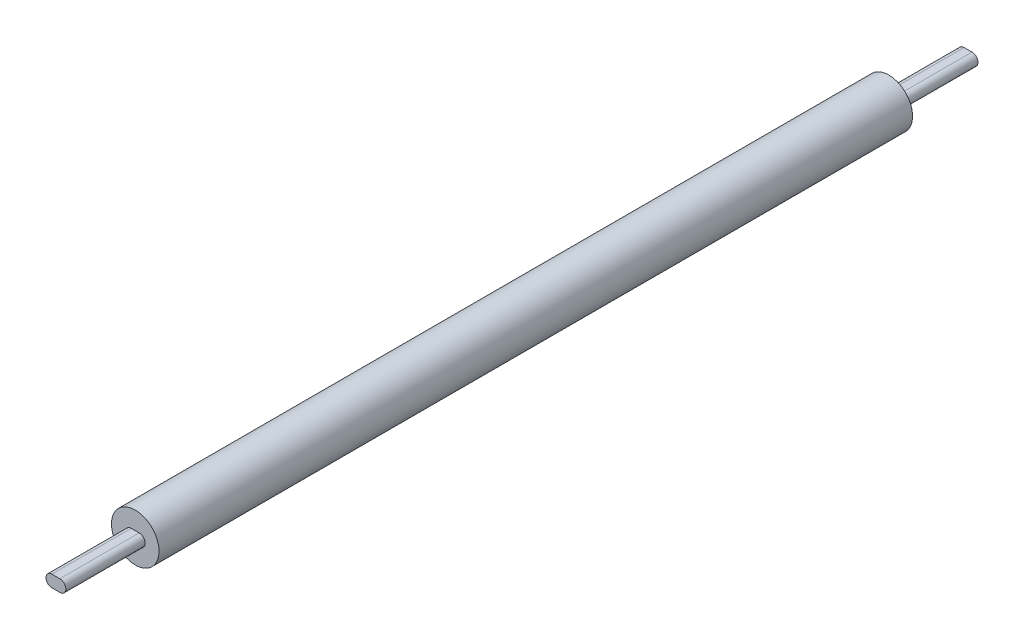
ISO-10303-21;
HEADER;
FILE_DESCRIPTION(('STEP AP214'),'2;1');
FILE_NAME('part.step','',(''),(''),'','','');
FILE_SCHEMA(('AUTOMOTIVE_DESIGN { 1 0 10303 214 1 1 1 1 }'));
ENDSEC;
DATA;
#1=APPLICATION_CONTEXT('core data for automotive mechanical design processes');
#2=APPLICATION_PROTOCOL_DEFINITION('international standard','automotive_design',2000,#1);
#3=PRODUCT_CONTEXT('',#1,'mechanical');
#4=PRODUCT('Part','Part','',(#3));
#5=PRODUCT_RELATED_PRODUCT_CATEGORY('part','',(#4));
#6=PRODUCT_DEFINITION_FORMATION('','',#4);
#7=PRODUCT_DEFINITION_CONTEXT('part definition',#1,'design');
#8=PRODUCT_DEFINITION('design','',#6,#7);
#9=PRODUCT_DEFINITION_SHAPE('','',#8);
#10=(LENGTH_UNIT() NAMED_UNIT(*) SI_UNIT(.MILLI.,.METRE.));
#11=(NAMED_UNIT(*) PLANE_ANGLE_UNIT() SI_UNIT($,.RADIAN.));
#12=(NAMED_UNIT(*) SI_UNIT($,.STERADIAN.) SOLID_ANGLE_UNIT());
#13=UNCERTAINTY_MEASURE_WITH_UNIT(LENGTH_MEASURE(1.E-05),#10,'distance_accuracy_value','');
#14=(GEOMETRIC_REPRESENTATION_CONTEXT(3) GLOBAL_UNCERTAINTY_ASSIGNED_CONTEXT((#13)) GLOBAL_UNIT_ASSIGNED_CONTEXT((#10,
#11,#12)) REPRESENTATION_CONTEXT('',''));
#15=CARTESIAN_POINT('',(0.,0.,0.));
#16=DIRECTION('',(0.,0.,1.));
#17=DIRECTION('',(1.,0.,0.));
#18=AXIS2_PLACEMENT_3D('',#15,#16,#17);
#19=CARTESIAN_POINT('',(0.,0.,0.));
#20=DIRECTION('',(0.,0.,1.));
#21=DIRECTION('',(1.,0.,0.));
#22=AXIS2_PLACEMENT_3D('',#19,#20,#21);
#23=PLANE('',#22);
#24=CARTESIAN_POINT('',(0.,0.,0.));
#25=DIRECTION('',(0.,0.,1.));
#26=DIRECTION('',(1.,0.,0.));
#27=AXIS2_PLACEMENT_3D('',#24,#25,#26);
#28=CIRCLE('',#27,6.);
#29=CARTESIAN_POINT('',(6.,0.,0.));
#30=VERTEX_POINT('',#29);
#31=EDGE_CURVE('E45',#30,#30,#28,.T.);
#32=ORIENTED_EDGE('',*,*,#31,.F.);
#33=EDGE_LOOP('',(#32));
#34=FACE_BOUND('',#33,.T.);
#35=CARTESIAN_POINT('',(1.,0.,0.));
#36=DIRECTION('',(0.,0.,-1.));
#37=DIRECTION('',(-1.,0.,0.));
#38=AXIS2_PLACEMENT_3D('',#35,#36,#37);
#39=CIRCLE('',#38,1.5);
#40=CARTESIAN_POINT('',(1.,1.5,0.));
#41=VERTEX_POINT('',#40);
#42=CARTESIAN_POINT('',(1.,-1.5,0.));
#43=VERTEX_POINT('',#42);
#44=EDGE_CURVE('E56',#41,#43,#39,.T.);
#45=ORIENTED_EDGE('',*,*,#44,.F.);
#46=DIRECTION('',(1.,0.,0.));
#47=VECTOR('',#46,1.);
#48=CARTESIAN_POINT('',(1.,1.5,0.));
#49=LINE('',#48,#47);
#50=CARTESIAN_POINT('',(-1.,1.5,0.));
#51=VERTEX_POINT('',#50);
#52=EDGE_CURVE('E60',#51,#41,#49,.T.);
#53=ORIENTED_EDGE('',*,*,#52,.F.);
#54=CARTESIAN_POINT('',(-1.,0.,0.));
#55=DIRECTION('',(0.,0.,-1.));
#56=DIRECTION('',(-1.,0.,0.));
#57=AXIS2_PLACEMENT_3D('',#54,#55,#56);
#58=CIRCLE('',#57,1.5);
#59=CARTESIAN_POINT('',(-1.,-1.5,0.));
#60=VERTEX_POINT('',#59);
#61=EDGE_CURVE('E290',#60,#51,#58,.T.);
#62=ORIENTED_EDGE('',*,*,#61,.F.);
#63=DIRECTION('',(-1.,0.,0.));
#64=VECTOR('',#63,1.);
#65=CARTESIAN_POINT('',(1.,-1.5,0.));
#66=LINE('',#65,#64);
#67=EDGE_CURVE('E296',#43,#60,#66,.T.);
#68=ORIENTED_EDGE('',*,*,#67,.F.);
#69=EDGE_LOOP('',(#45,#53,#62,#68));
#70=FACE_BOUND('',#69,.T.);
#71=ADVANCED_FACE('F41',(#34,#70),#23,.F.);
#72=CARTESIAN_POINT('',(0.,0.,190.));
#73=DIRECTION('',(0.,0.,-1.));
#74=DIRECTION('',(-1.,0.,0.));
#75=AXIS2_PLACEMENT_3D('',#72,#73,#74);
#76=CYLINDRICAL_SURFACE('',#75,6.);
#77=CARTESIAN_POINT('',(0.,0.,190.));
#78=DIRECTION('',(0.,0.,1.));
#79=DIRECTION('',(1.,0.,0.));
#80=AXIS2_PLACEMENT_3D('',#77,#78,#79);
#81=CIRCLE('',#80,6.);
#82=CARTESIAN_POINT('',(6.,0.,190.));
#83=VERTEX_POINT('',#82);
#84=EDGE_CURVE('E11',#83,#83,#81,.T.);
#85=ORIENTED_EDGE('',*,*,#84,.F.);
#86=EDGE_LOOP('',(#85));
#87=FACE_BOUND('',#86,.T.);
#88=ORIENTED_EDGE('',*,*,#31,.T.);
#89=EDGE_LOOP('',(#88));
#90=FACE_BOUND('',#89,.T.);
#91=ADVANCED_FACE('F43',(#87,#90),#76,.T.);
#92=CARTESIAN_POINT('',(0.,0.,190.));
#93=DIRECTION('',(0.,0.,1.));
#94=DIRECTION('',(1.,0.,0.));
#95=AXIS2_PLACEMENT_3D('',#92,#93,#94);
#96=PLANE('',#95);
#97=CARTESIAN_POINT('',(-1.,0.,190.));
#98=DIRECTION('',(0.,0.,1.));
#99=DIRECTION('',(1.,0.,0.));
#100=AXIS2_PLACEMENT_3D('',#97,#98,#99);
#101=CIRCLE('',#100,1.5);
#102=CARTESIAN_POINT('',(-1.,1.5,190.));
#103=VERTEX_POINT('',#102);
#104=CARTESIAN_POINT('',(-1.,-1.5,190.));
#105=VERTEX_POINT('',#104);
#106=EDGE_CURVE('E126',#103,#105,#101,.T.);
#107=ORIENTED_EDGE('',*,*,#106,.F.);
#108=DIRECTION('',(-1.,0.,0.));
#109=VECTOR('',#108,1.);
#110=CARTESIAN_POINT('',(-1.,1.5,190.));
#111=LINE('',#110,#109);
#112=CARTESIAN_POINT('',(1.,1.5,190.));
#113=VERTEX_POINT('',#112);
#114=EDGE_CURVE('E139',#113,#103,#111,.T.);
#115=ORIENTED_EDGE('',*,*,#114,.F.);
#116=CARTESIAN_POINT('',(1.,0.,190.));
#117=DIRECTION('',(0.,0.,1.));
#118=DIRECTION('',(1.,0.,0.));
#119=AXIS2_PLACEMENT_3D('',#116,#117,#118);
#120=CIRCLE('',#119,1.5);
#121=CARTESIAN_POINT('',(1.,-1.5,190.));
#122=VERTEX_POINT('',#121);
#123=EDGE_CURVE('E148',#122,#113,#120,.T.);
#124=ORIENTED_EDGE('',*,*,#123,.F.);
#125=DIRECTION('',(1.,0.,0.));
#126=VECTOR('',#125,1.);
#127=CARTESIAN_POINT('',(-1.,-1.5,190.));
#128=LINE('',#127,#126);
#129=EDGE_CURVE('E129',#105,#122,#128,.T.);
#130=ORIENTED_EDGE('',*,*,#129,.F.);
#131=EDGE_LOOP('',(#107,#115,#124,#130));
#132=FACE_BOUND('',#131,.T.);
#133=ORIENTED_EDGE('',*,*,#84,.T.);
#134=EDGE_LOOP('',(#133));
#135=FACE_BOUND('',#134,.T.);
#136=ADVANCED_FACE('F173',(#132,#135),#96,.T.);
#137=CARTESIAN_POINT('',(-1.,0.,210.));
#138=DIRECTION('',(0.,0.,-1.));
#139=DIRECTION('',(-1.,0.,0.));
#140=AXIS2_PLACEMENT_3D('',#137,#138,#139);
#141=CYLINDRICAL_SURFACE('',#140,1.5);
#142=ORIENTED_EDGE('',*,*,#106,.T.);
#143=DIRECTION('',(0.,0.,-1.));
#144=VECTOR('',#143,1.);
#145=CARTESIAN_POINT('',(-1.,-1.5,210.));
#146=LINE('',#145,#144);
#147=CARTESIAN_POINT('',(-1.,-1.5,210.));
#148=VERTEX_POINT('',#147);
#149=EDGE_CURVE('E161',#148,#105,#146,.T.);
#150=ORIENTED_EDGE('',*,*,#149,.F.);
#151=CARTESIAN_POINT('',(-1.,0.,210.));
#152=DIRECTION('',(0.,0.,1.));
#153=DIRECTION('',(1.,0.,0.));
#154=AXIS2_PLACEMENT_3D('',#151,#152,#153);
#155=CIRCLE('',#154,1.5);
#156=CARTESIAN_POINT('',(-1.,1.5,210.));
#157=VERTEX_POINT('',#156);
#158=EDGE_CURVE('E135',#157,#148,#155,.T.);
#159=ORIENTED_EDGE('',*,*,#158,.F.);
#160=DIRECTION('',(0.,0.,-1.));
#161=VECTOR('',#160,1.);
#162=CARTESIAN_POINT('',(-1.,1.5,210.));
#163=LINE('',#162,#161);
#164=EDGE_CURVE('E144',#157,#103,#163,.T.);
#165=ORIENTED_EDGE('',*,*,#164,.T.);
#166=EDGE_LOOP('',(#142,#150,#159,#165));
#167=FACE_BOUND('',#166,.T.);
#168=ADVANCED_FACE('F178',(#167),#141,.T.);
#169=CARTESIAN_POINT('',(-1.,-1.5,210.));
#170=DIRECTION('',(0.,1.,0.));
#171=DIRECTION('',(0.,0.,1.));
#172=AXIS2_PLACEMENT_3D('',#169,#170,#171);
#173=PLANE('',#172);
#174=ORIENTED_EDGE('',*,*,#129,.T.);
#175=DIRECTION('',(0.,0.,-1.));
#176=VECTOR('',#175,1.);
#177=CARTESIAN_POINT('',(1.,-1.5,210.));
#178=LINE('',#177,#176);
#179=CARTESIAN_POINT('',(1.,-1.5,210.));
#180=VERTEX_POINT('',#179);
#181=EDGE_CURVE('E158',#180,#122,#178,.T.);
#182=ORIENTED_EDGE('',*,*,#181,.F.);
#183=DIRECTION('',(1.,0.,0.));
#184=VECTOR('',#183,1.);
#185=CARTESIAN_POINT('',(-1.,-1.5,210.));
#186=LINE('',#185,#184);
#187=EDGE_CURVE('E138',#148,#180,#186,.T.);
#188=ORIENTED_EDGE('',*,*,#187,.F.);
#189=ORIENTED_EDGE('',*,*,#149,.T.);
#190=EDGE_LOOP('',(#174,#182,#188,#189));
#191=FACE_BOUND('',#190,.T.);
#192=ADVANCED_FACE('F182',(#191),#173,.F.);
#193=CARTESIAN_POINT('',(1.,0.,210.));
#194=DIRECTION('',(0.,0.,-1.));
#195=DIRECTION('',(-1.,0.,0.));
#196=AXIS2_PLACEMENT_3D('',#193,#194,#195);
#197=CYLINDRICAL_SURFACE('',#196,1.5);
#198=ORIENTED_EDGE('',*,*,#123,.T.);
#199=DIRECTION('',(0.,0.,-1.));
#200=VECTOR('',#199,1.);
#201=CARTESIAN_POINT('',(1.,1.5,210.));
#202=LINE('',#201,#200);
#203=CARTESIAN_POINT('',(1.,1.5,210.));
#204=VERTEX_POINT('',#203);
#205=EDGE_CURVE('E155',#204,#113,#202,.T.);
#206=ORIENTED_EDGE('',*,*,#205,.F.);
#207=CARTESIAN_POINT('',(1.,0.,210.));
#208=DIRECTION('',(0.,0.,1.));
#209=DIRECTION('',(1.,0.,0.));
#210=AXIS2_PLACEMENT_3D('',#207,#208,#209);
#211=CIRCLE('',#210,1.5);
#212=EDGE_CURVE('E141',#180,#204,#211,.T.);
#213=ORIENTED_EDGE('',*,*,#212,.F.);
#214=ORIENTED_EDGE('',*,*,#181,.T.);
#215=EDGE_LOOP('',(#198,#206,#213,#214));
#216=FACE_BOUND('',#215,.T.);
#217=ADVANCED_FACE('F186',(#216),#197,.T.);
#218=CARTESIAN_POINT('',(-1.,1.5,210.));
#219=DIRECTION('',(0.,-1.,0.));
#220=DIRECTION('',(0.,0.,-1.));
#221=AXIS2_PLACEMENT_3D('',#218,#219,#220);
#222=PLANE('',#221);
#223=ORIENTED_EDGE('',*,*,#114,.T.);
#224=ORIENTED_EDGE('',*,*,#164,.F.);
#225=DIRECTION('',(-1.,0.,0.));
#226=VECTOR('',#225,1.);
#227=CARTESIAN_POINT('',(-1.,1.5,210.));
#228=LINE('',#227,#226);
#229=EDGE_CURVE('E143',#204,#157,#228,.T.);
#230=ORIENTED_EDGE('',*,*,#229,.F.);
#231=ORIENTED_EDGE('',*,*,#205,.T.);
#232=EDGE_LOOP('',(#223,#224,#230,#231));
#233=FACE_BOUND('',#232,.T.);
#234=ADVANCED_FACE('F189',(#233),#222,.F.);
#235=CARTESIAN_POINT('',(-1.,0.,210.));
#236=DIRECTION('',(0.,0.,1.));
#237=DIRECTION('',(1.,0.,0.));
#238=AXIS2_PLACEMENT_3D('',#235,#236,#237);
#239=PLANE('',#238);
#240=ORIENTED_EDGE('',*,*,#158,.T.);
#241=ORIENTED_EDGE('',*,*,#187,.T.);
#242=ORIENTED_EDGE('',*,*,#212,.T.);
#243=ORIENTED_EDGE('',*,*,#229,.T.);
#244=EDGE_LOOP('',(#240,#241,#242,#243));
#245=FACE_BOUND('',#244,.T.);
#246=ADVANCED_FACE('F193',(#245),#239,.T.);
#247=CARTESIAN_POINT('',(1.,0.,-20.));
#248=DIRECTION('',(0.,0.,1.));
#249=DIRECTION('',(1.,0.,0.));
#250=AXIS2_PLACEMENT_3D('',#247,#248,#249);
#251=CYLINDRICAL_SURFACE('',#250,1.5);
#252=ORIENTED_EDGE('',*,*,#44,.T.);
#253=DIRECTION('',(0.,0.,1.));
#254=VECTOR('',#253,1.);
#255=CARTESIAN_POINT('',(1.,-1.5,-20.));
#256=LINE('',#255,#254);
#257=CARTESIAN_POINT('',(1.,-1.5,-20.));
#258=VERTEX_POINT('',#257);
#259=EDGE_CURVE('E109',#258,#43,#256,.T.);
#260=ORIENTED_EDGE('',*,*,#259,.F.);
#261=CARTESIAN_POINT('',(1.,0.,-20.));
#262=DIRECTION('',(0.,0.,-1.));
#263=DIRECTION('',(-1.,0.,0.));
#264=AXIS2_PLACEMENT_3D('',#261,#262,#263);
#265=CIRCLE('',#264,1.5);
#266=CARTESIAN_POINT('',(1.,1.5,-20.));
#267=VERTEX_POINT('',#266);
#268=EDGE_CURVE('E115',#267,#258,#265,.T.);
#269=ORIENTED_EDGE('',*,*,#268,.F.);
#270=DIRECTION('',(0.,0.,1.));
#271=VECTOR('',#270,1.);
#272=CARTESIAN_POINT('',(1.,1.5,-20.));
#273=LINE('',#272,#271);
#274=EDGE_CURVE('E288',#267,#41,#273,.T.);
#275=ORIENTED_EDGE('',*,*,#274,.T.);
#276=EDGE_LOOP('',(#252,#260,#269,#275));
#277=FACE_BOUND('',#276,.T.);
#278=ADVANCED_FACE('F125',(#277),#251,.T.);
#279=CARTESIAN_POINT('',(1.,-1.5,-20.));
#280=DIRECTION('',(0.,1.,0.));
#281=DIRECTION('',(0.,0.,1.));
#282=AXIS2_PLACEMENT_3D('',#279,#280,#281);
#283=PLANE('',#282);
#284=ORIENTED_EDGE('',*,*,#67,.T.);
#285=DIRECTION('',(0.,0.,1.));
#286=VECTOR('',#285,1.);
#287=CARTESIAN_POINT('',(-1.,-1.5,-20.));
#288=LINE('',#287,#286);
#289=CARTESIAN_POINT('',(-1.,-1.5,-20.));
#290=VERTEX_POINT('',#289);
#291=EDGE_CURVE('E111',#290,#60,#288,.T.);
#292=ORIENTED_EDGE('',*,*,#291,.F.);
#293=DIRECTION('',(-1.,0.,0.));
#294=VECTOR('',#293,1.);
#295=CARTESIAN_POINT('',(1.,-1.5,-20.));
#296=LINE('',#295,#294);
#297=EDGE_CURVE('E104',#258,#290,#296,.T.);
#298=ORIENTED_EDGE('',*,*,#297,.F.);
#299=ORIENTED_EDGE('',*,*,#259,.T.);
#300=EDGE_LOOP('',(#284,#292,#298,#299));
#301=FACE_BOUND('',#300,.T.);
#302=ADVANCED_FACE('F107',(#301),#283,.F.);
#303=CARTESIAN_POINT('',(-1.,0.,-20.));
#304=DIRECTION('',(0.,0.,1.));
#305=DIRECTION('',(1.,0.,0.));
#306=AXIS2_PLACEMENT_3D('',#303,#304,#305);
#307=CYLINDRICAL_SURFACE('',#306,1.5);
#308=ORIENTED_EDGE('',*,*,#61,.T.);
#309=DIRECTION('',(0.,0.,1.));
#310=VECTOR('',#309,1.);
#311=CARTESIAN_POINT('',(-1.,1.5,-20.));
#312=LINE('',#311,#310);
#313=CARTESIAN_POINT('',(-1.,1.5,-20.));
#314=VERTEX_POINT('',#313);
#315=EDGE_CURVE('E131',#314,#51,#312,.T.);
#316=ORIENTED_EDGE('',*,*,#315,.F.);
#317=CARTESIAN_POINT('',(-1.,0.,-20.));
#318=DIRECTION('',(0.,0.,-1.));
#319=DIRECTION('',(-1.,0.,0.));
#320=AXIS2_PLACEMENT_3D('',#317,#318,#319);
#321=CIRCLE('',#320,1.5);
#322=EDGE_CURVE('E114',#290,#314,#321,.T.);
#323=ORIENTED_EDGE('',*,*,#322,.F.);
#324=ORIENTED_EDGE('',*,*,#291,.T.);
#325=EDGE_LOOP('',(#308,#316,#323,#324));
#326=FACE_BOUND('',#325,.T.);
#327=ADVANCED_FACE('F202',(#326),#307,.T.);
#328=CARTESIAN_POINT('',(1.,1.5,-20.));
#329=DIRECTION('',(0.,-1.,0.));
#330=DIRECTION('',(0.,0.,-1.));
#331=AXIS2_PLACEMENT_3D('',#328,#329,#330);
#332=PLANE('',#331);
#333=ORIENTED_EDGE('',*,*,#52,.T.);
#334=ORIENTED_EDGE('',*,*,#274,.F.);
#335=DIRECTION('',(1.,0.,0.));
#336=VECTOR('',#335,1.);
#337=CARTESIAN_POINT('',(1.,1.5,-20.));
#338=LINE('',#337,#336);
#339=EDGE_CURVE('E120',#314,#267,#338,.T.);
#340=ORIENTED_EDGE('',*,*,#339,.F.);
#341=ORIENTED_EDGE('',*,*,#315,.T.);
#342=EDGE_LOOP('',(#333,#334,#340,#341));
#343=FACE_BOUND('',#342,.T.);
#344=ADVANCED_FACE('F205',(#343),#332,.F.);
#345=CARTESIAN_POINT('',(1.,0.,-20.));
#346=DIRECTION('',(0.,0.,-1.));
#347=DIRECTION('',(-1.,0.,0.));
#348=AXIS2_PLACEMENT_3D('',#345,#346,#347);
#349=PLANE('',#348);
#350=ORIENTED_EDGE('',*,*,#268,.T.);
#351=ORIENTED_EDGE('',*,*,#297,.T.);
#352=ORIENTED_EDGE('',*,*,#322,.T.);
#353=ORIENTED_EDGE('',*,*,#339,.T.);
#354=EDGE_LOOP('',(#350,#351,#352,#353));
#355=FACE_BOUND('',#354,.T.);
#356=ADVANCED_FACE('F118',(#355),#349,.T.);
#357=CLOSED_SHELL('',(#71,#91,#136,#168,#192,#217,#234,#246,#278,#302,#327,#344,#356));
#358=MANIFOLD_SOLID_BREP('B2',#357);
#359=ADVANCED_BREP_SHAPE_REPRESENTATION('',(#18,#358),#14);
#360=SHAPE_DEFINITION_REPRESENTATION(#9,#359);
ENDSEC;
END-ISO-10303-21;
